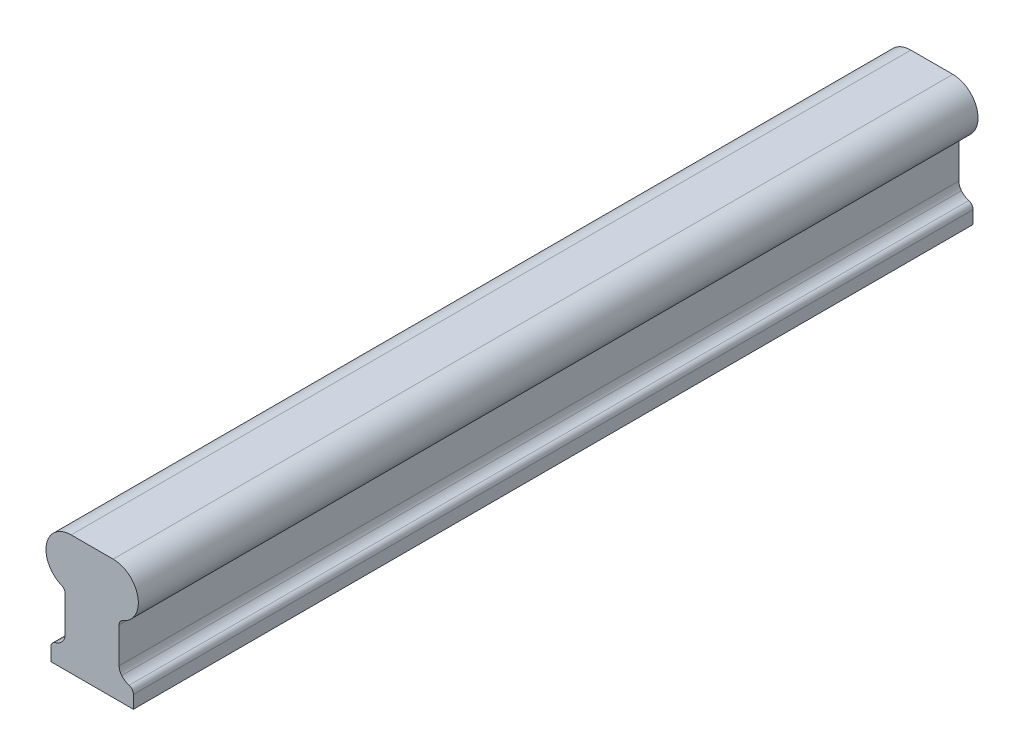
ISO-10303-21;
HEADER;
FILE_DESCRIPTION(('STEP AP214'),'2;1');
FILE_NAME('part.step','',(''),(''),'','','');
FILE_SCHEMA(('AUTOMOTIVE_DESIGN { 1 0 10303 214 1 1 1 1 }'));
ENDSEC;
DATA;
#1=APPLICATION_CONTEXT('core data for automotive mechanical design processes');
#2=APPLICATION_PROTOCOL_DEFINITION('international standard','automotive_design',2000,#1);
#3=PRODUCT_CONTEXT('',#1,'mechanical');
#4=PRODUCT('Part','Part','',(#3));
#5=PRODUCT_RELATED_PRODUCT_CATEGORY('part','',(#4));
#6=PRODUCT_DEFINITION_FORMATION('','',#4);
#7=PRODUCT_DEFINITION_CONTEXT('part definition',#1,'design');
#8=PRODUCT_DEFINITION('design','',#6,#7);
#9=PRODUCT_DEFINITION_SHAPE('','',#8);
#10=(LENGTH_UNIT() NAMED_UNIT(*) SI_UNIT(.MILLI.,.METRE.));
#11=(NAMED_UNIT(*) PLANE_ANGLE_UNIT() SI_UNIT($,.RADIAN.));
#12=(NAMED_UNIT(*) SI_UNIT($,.STERADIAN.) SOLID_ANGLE_UNIT());
#13=UNCERTAINTY_MEASURE_WITH_UNIT(LENGTH_MEASURE(1.E-05),#10,'distance_accuracy_value','');
#14=(GEOMETRIC_REPRESENTATION_CONTEXT(3) GLOBAL_UNCERTAINTY_ASSIGNED_CONTEXT((#13)) GLOBAL_UNIT_ASSIGNED_CONTEXT((#10,
#11,#12)) REPRESENTATION_CONTEXT('',''));
#15=CARTESIAN_POINT('',(0.,0.,0.));
#16=DIRECTION('',(0.,0.,1.));
#17=DIRECTION('',(1.,0.,0.));
#18=AXIS2_PLACEMENT_3D('',#15,#16,#17);
#19=CARTESIAN_POINT('',(0.,0.,355.6));
#20=DIRECTION('',(1.,0.,0.));
#21=DIRECTION('',(0.,0.,-1.));
#22=AXIS2_PLACEMENT_3D('',#19,#20,#21);
#23=PLANE('',#22);
#24=DIRECTION('',(0.,-1.,0.));
#25=VECTOR('',#24,1.);
#26=CARTESIAN_POINT('',(0.,0.,0.));
#27=LINE('',#26,#25);
#28=CARTESIAN_POINT('',(0.,5.4700903291992,0.));
#29=VERTEX_POINT('',#28);
#30=CARTESIAN_POINT('',(0.,0.,0.));
#31=VERTEX_POINT('',#30);
#32=EDGE_CURVE('E181',#29,#31,#27,.T.);
#33=ORIENTED_EDGE('',*,*,#32,.T.);
#34=DIRECTION('',(0.,0.,-1.));
#35=VECTOR('',#34,1.);
#36=CARTESIAN_POINT('',(0.,0.,355.6));
#37=LINE('',#36,#35);
#38=CARTESIAN_POINT('',(0.,0.,355.6));
#39=VERTEX_POINT('',#38);
#40=EDGE_CURVE('E11',#39,#31,#37,.T.);
#41=ORIENTED_EDGE('',*,*,#40,.F.);
#42=DIRECTION('',(0.,-1.,0.));
#43=VECTOR('',#42,1.);
#44=CARTESIAN_POINT('',(0.,0.,355.6));
#45=LINE('',#44,#43);
#46=CARTESIAN_POINT('',(0.,5.4700903291992,355.6));
#47=VERTEX_POINT('',#46);
#48=EDGE_CURVE('E211',#47,#39,#45,.T.);
#49=ORIENTED_EDGE('',*,*,#48,.F.);
#50=DIRECTION('',(0.,0.,-1.));
#51=VECTOR('',#50,1.);
#52=CARTESIAN_POINT('',(0.,5.4700903291992,355.6));
#53=LINE('',#52,#51);
#54=EDGE_CURVE('E177',#47,#29,#53,.T.);
#55=ORIENTED_EDGE('',*,*,#54,.T.);
#56=EDGE_LOOP('',(#33,#41,#49,#55));
#57=FACE_BOUND('',#56,.T.);
#58=ADVANCED_FACE('F37',(#57),#23,.F.);
#59=CARTESIAN_POINT('',(0.,0.,355.6));
#60=DIRECTION('',(0.,1.,0.));
#61=DIRECTION('',(0.,0.,1.));
#62=AXIS2_PLACEMENT_3D('',#59,#60,#61);
#63=PLANE('',#62);
#64=DIRECTION('',(1.,0.,0.));
#65=VECTOR('',#64,1.);
#66=CARTESIAN_POINT('',(0.,0.,0.));
#67=LINE('',#66,#65);
#68=CARTESIAN_POINT('',(34.925,0.,0.));
#69=VERTEX_POINT('',#68);
#70=EDGE_CURVE('E184',#31,#69,#67,.T.);
#71=ORIENTED_EDGE('',*,*,#70,.T.);
#72=DIRECTION('',(0.,0.,-1.));
#73=VECTOR('',#72,1.);
#74=CARTESIAN_POINT('',(34.925,0.,355.6));
#75=LINE('',#74,#73);
#76=CARTESIAN_POINT('',(34.925,0.,355.6));
#77=VERTEX_POINT('',#76);
#78=EDGE_CURVE('E45',#77,#69,#75,.T.);
#79=ORIENTED_EDGE('',*,*,#78,.F.);
#80=DIRECTION('',(1.,0.,0.));
#81=VECTOR('',#80,1.);
#82=CARTESIAN_POINT('',(0.,0.,355.6));
#83=LINE('',#82,#81);
#84=EDGE_CURVE('E120',#39,#77,#83,.T.);
#85=ORIENTED_EDGE('',*,*,#84,.F.);
#86=ORIENTED_EDGE('',*,*,#40,.T.);
#87=EDGE_LOOP('',(#71,#79,#85,#86));
#88=FACE_BOUND('',#87,.T.);
#89=ADVANCED_FACE('F309',(#88),#63,.F.);
#90=CARTESIAN_POINT('',(34.925,0.,355.6));
#91=DIRECTION('',(-1.,0.,0.));
#92=DIRECTION('',(0.,0.,1.));
#93=AXIS2_PLACEMENT_3D('',#90,#91,#92);
#94=PLANE('',#93);
#95=DIRECTION('',(0.,1.,0.));
#96=VECTOR('',#95,1.);
#97=CARTESIAN_POINT('',(34.925,0.,0.));
#98=LINE('',#97,#96);
#99=CARTESIAN_POINT('',(34.925,5.4700903291992,0.));
#100=VERTEX_POINT('',#99);
#101=EDGE_CURVE('E186',#69,#100,#98,.T.);
#102=ORIENTED_EDGE('',*,*,#101,.T.);
#103=DIRECTION('',(0.,0.,-1.));
#104=VECTOR('',#103,1.);
#105=CARTESIAN_POINT('',(34.925,5.4700903291992,355.6));
#106=LINE('',#105,#104);
#107=CARTESIAN_POINT('',(34.925,5.4700903291992,355.6));
#108=VERTEX_POINT('',#107);
#109=EDGE_CURVE('E242',#108,#100,#106,.T.);
#110=ORIENTED_EDGE('',*,*,#109,.F.);
#111=DIRECTION('',(0.,1.,0.));
#112=VECTOR('',#111,1.);
#113=CARTESIAN_POINT('',(34.925,0.,355.6));
#114=LINE('',#113,#112);
#115=EDGE_CURVE('E250',#77,#108,#114,.T.);
#116=ORIENTED_EDGE('',*,*,#115,.F.);
#117=ORIENTED_EDGE('',*,*,#78,.T.);
#118=EDGE_LOOP('',(#102,#110,#116,#117));
#119=FACE_BOUND('',#118,.T.);
#120=ADVANCED_FACE('F248',(#119),#94,.F.);
#121=CARTESIAN_POINT('',(32.385,5.4700903291992,355.6));
#122=DIRECTION('',(0.,0.,-1.));
#123=DIRECTION('',(-1.,0.,0.));
#124=AXIS2_PLACEMENT_3D('',#121,#122,#123);
#125=CYLINDRICAL_SURFACE('',#124,2.54);
#126=CARTESIAN_POINT('',(32.385,5.4700903291992,0.));
#127=DIRECTION('',(0.,0.,1.));
#128=DIRECTION('',(-1.,0.,0.));
#129=AXIS2_PLACEMENT_3D('',#126,#127,#128);
#130=CIRCLE('',#129,2.54);
#131=CARTESIAN_POINT('',(33.1030882831289,7.90647068079312,0.));
#132=VERTEX_POINT('',#131);
#133=EDGE_CURVE('E188',#100,#132,#130,.T.);
#134=ORIENTED_EDGE('',*,*,#133,.T.);
#135=DIRECTION('',(0.,0.,-1.));
#136=VECTOR('',#135,1.);
#137=CARTESIAN_POINT('',(33.1030882831289,7.90647068079312,355.6));
#138=LINE('',#137,#136);
#139=CARTESIAN_POINT('',(33.1030882831289,7.90647068079312,355.6));
#140=VERTEX_POINT('',#139);
#141=EDGE_CURVE('E239',#140,#132,#138,.T.);
#142=ORIENTED_EDGE('',*,*,#141,.F.);
#143=CARTESIAN_POINT('',(32.385,5.4700903291992,355.6));
#144=DIRECTION('',(0.,0.,1.));
#145=DIRECTION('',(-1.,0.,0.));
#146=AXIS2_PLACEMENT_3D('',#143,#144,#145);
#147=CIRCLE('',#146,2.54);
#148=EDGE_CURVE('E268',#108,#140,#147,.T.);
#149=ORIENTED_EDGE('',*,*,#148,.F.);
#150=ORIENTED_EDGE('',*,*,#109,.T.);
#151=EDGE_LOOP('',(#134,#142,#149,#150));
#152=FACE_BOUND('',#151,.T.);
#153=ADVANCED_FACE('F259',(#152),#125,.T.);
#154=CARTESIAN_POINT('',(34.925,14.0879806895373,355.6));
#155=DIRECTION('',(0.,0.,-1.));
#156=DIRECTION('',(-1.,0.,0.));
#157=AXIS2_PLACEMENT_3D('',#154,#155,#156);
#158=CYLINDRICAL_SURFACE('',#157,6.44441062412048);
#159=CARTESIAN_POINT('',(34.925,14.0879806895373,0.));
#160=DIRECTION('',(0.,0.,-1.));
#161=DIRECTION('',(-1.,0.,0.));
#162=AXIS2_PLACEMENT_3D('',#159,#160,#161);
#163=CIRCLE('',#162,6.44441062412048);
#164=CARTESIAN_POINT('',(29.9877953084063,9.94618903306999,0.));
#165=VERTEX_POINT('',#164);
#166=EDGE_CURVE('E190',#132,#165,#163,.T.);
#167=ORIENTED_EDGE('',*,*,#166,.T.);
#168=DIRECTION('',(0.,0.,-1.));
#169=VECTOR('',#168,1.);
#170=CARTESIAN_POINT('',(29.9877953084063,9.94618903306999,355.6));
#171=LINE('',#170,#169);
#172=CARTESIAN_POINT('',(29.9877953084063,9.94618903306999,355.6));
#173=VERTEX_POINT('',#172);
#174=EDGE_CURVE('E236',#173,#165,#171,.T.);
#175=ORIENTED_EDGE('',*,*,#174,.F.);
#176=CARTESIAN_POINT('',(34.925,14.0879806895373,355.6));
#177=DIRECTION('',(0.,0.,-1.));
#178=DIRECTION('',(-1.,0.,0.));
#179=AXIS2_PLACEMENT_3D('',#176,#177,#178);
#180=CIRCLE('',#179,6.44441062412048);
#181=EDGE_CURVE('E265',#140,#173,#180,.T.);
#182=ORIENTED_EDGE('',*,*,#181,.F.);
#183=ORIENTED_EDGE('',*,*,#141,.T.);
#184=EDGE_LOOP('',(#167,#175,#182,#183));
#185=FACE_BOUND('',#184,.T.);
#186=ADVANCED_FACE('F263',(#185),#158,.F.);
#187=CARTESIAN_POINT('',(33.5756906441674,12.9560530946583,355.6));
#188=DIRECTION('',(0.,0.,-1.));
#189=DIRECTION('',(-1.,0.,0.));
#190=AXIS2_PLACEMENT_3D('',#187,#188,#189);
#191=CYLINDRICAL_SURFACE('',#190,4.68319064416736);
#192=CARTESIAN_POINT('',(33.5756906441674,12.9560530946583,0.));
#193=DIRECTION('',(0.,0.,-1.));
#194=DIRECTION('',(1.,0.,0.));
#195=AXIS2_PLACEMENT_3D('',#192,#193,#194);
#196=CIRCLE('',#195,4.68319064416736);
#197=CARTESIAN_POINT('',(28.8925,12.9560530946583,0.));
#198=VERTEX_POINT('',#197);
#199=EDGE_CURVE('E192',#165,#198,#196,.T.);
#200=ORIENTED_EDGE('',*,*,#199,.T.);
#201=DIRECTION('',(0.,0.,-1.));
#202=VECTOR('',#201,1.);
#203=CARTESIAN_POINT('',(28.8925,12.9560530946583,355.6));
#204=LINE('',#203,#202);
#205=CARTESIAN_POINT('',(28.8925,12.9560530946583,355.6));
#206=VERTEX_POINT('',#205);
#207=EDGE_CURVE('E233',#206,#198,#204,.T.);
#208=ORIENTED_EDGE('',*,*,#207,.F.);
#209=CARTESIAN_POINT('',(33.5756906441674,12.9560530946583,355.6));
#210=DIRECTION('',(0.,0.,-1.));
#211=DIRECTION('',(1.,0.,0.));
#212=AXIS2_PLACEMENT_3D('',#209,#210,#211);
#213=CIRCLE('',#212,4.68319064416736);
#214=EDGE_CURVE('E267',#173,#206,#213,.T.);
#215=ORIENTED_EDGE('',*,*,#214,.F.);
#216=ORIENTED_EDGE('',*,*,#174,.T.);
#217=EDGE_LOOP('',(#200,#208,#215,#216));
#218=FACE_BOUND('',#217,.T.);
#219=ADVANCED_FACE('F322',(#218),#191,.F.);
#220=CARTESIAN_POINT('',(28.8925,27.94,355.6));
#221=DIRECTION('',(-1.,0.,0.));
#222=DIRECTION('',(0.,-1.,0.));
#223=AXIS2_PLACEMENT_3D('',#220,#221,#222);
#224=PLANE('',#223);
#225=DIRECTION('',(0.,1.,0.));
#226=VECTOR('',#225,1.);
#227=CARTESIAN_POINT('',(28.8925,27.94,0.));
#228=LINE('',#227,#226);
#229=CARTESIAN_POINT('',(28.8925,27.94,0.));
#230=VERTEX_POINT('',#229);
#231=EDGE_CURVE('E194',#198,#230,#228,.T.);
#232=ORIENTED_EDGE('',*,*,#231,.T.);
#233=DIRECTION('',(0.,0.,-1.));
#234=VECTOR('',#233,1.);
#235=CARTESIAN_POINT('',(28.8925,27.94,355.6));
#236=LINE('',#235,#234);
#237=CARTESIAN_POINT('',(28.8925,27.94,355.6));
#238=VERTEX_POINT('',#237);
#239=EDGE_CURVE('E230',#238,#230,#236,.T.);
#240=ORIENTED_EDGE('',*,*,#239,.F.);
#241=DIRECTION('',(0.,1.,0.));
#242=VECTOR('',#241,1.);
#243=CARTESIAN_POINT('',(28.8925,27.94,355.6));
#244=LINE('',#243,#242);
#245=EDGE_CURVE('E270',#206,#238,#244,.T.);
#246=ORIENTED_EDGE('',*,*,#245,.F.);
#247=ORIENTED_EDGE('',*,*,#207,.T.);
#248=EDGE_LOOP('',(#232,#240,#246,#247));
#249=FACE_BOUND('',#248,.T.);
#250=ADVANCED_FACE('F325',(#249),#224,.F.);
#251=CARTESIAN_POINT('',(31.4325,27.94,355.6));
#252=DIRECTION('',(0.,0.,-1.));
#253=DIRECTION('',(-1.,0.,0.));
#254=AXIS2_PLACEMENT_3D('',#251,#252,#253);
#255=CYLINDRICAL_SURFACE('',#254,2.54);
#256=CARTESIAN_POINT('',(31.4325,27.94,0.));
#257=DIRECTION('',(0.,0.,-1.));
#258=DIRECTION('',(-1.,0.,0.));
#259=AXIS2_PLACEMENT_3D('',#256,#257,#258);
#260=CIRCLE('',#259,2.54);
#261=CARTESIAN_POINT('',(30.4555769230769,30.2846153846154,0.));
#262=VERTEX_POINT('',#261);
#263=EDGE_CURVE('E196',#230,#262,#260,.T.);
#264=ORIENTED_EDGE('',*,*,#263,.T.);
#265=DIRECTION('',(0.,0.,-1.));
#266=VECTOR('',#265,1.);
#267=CARTESIAN_POINT('',(30.4555769230769,30.2846153846154,355.6));
#268=LINE('',#267,#266);
#269=CARTESIAN_POINT('',(30.4555769230769,30.2846153846154,355.6));
#270=VERTEX_POINT('',#269);
#271=EDGE_CURVE('E227',#270,#262,#268,.T.);
#272=ORIENTED_EDGE('',*,*,#271,.F.);
#273=CARTESIAN_POINT('',(31.4325,27.94,355.6));
#274=DIRECTION('',(0.,0.,-1.));
#275=DIRECTION('',(-1.,0.,0.));
#276=AXIS2_PLACEMENT_3D('',#273,#274,#275);
#277=CIRCLE('',#276,2.54);
#278=EDGE_CURVE('E276',#238,#270,#277,.T.);
#279=ORIENTED_EDGE('',*,*,#278,.F.);
#280=ORIENTED_EDGE('',*,*,#239,.T.);
#281=EDGE_LOOP('',(#264,#272,#279,#280));
#282=FACE_BOUND('',#281,.T.);
#283=ADVANCED_FACE('F329',(#282),#255,.F.);
#284=CARTESIAN_POINT('',(26.3525,40.132,355.6));
#285=DIRECTION('',(0.,0.,-1.));
#286=DIRECTION('',(-1.,0.,0.));
#287=AXIS2_PLACEMENT_3D('',#284,#285,#286);
#288=CYLINDRICAL_SURFACE('',#287,10.668);
#289=CARTESIAN_POINT('',(26.3525,40.132,0.));
#290=DIRECTION('',(0.,0.,1.));
#291=DIRECTION('',(-1.,0.,0.));
#292=AXIS2_PLACEMENT_3D('',#289,#290,#291);
#293=CIRCLE('',#292,10.668);
#294=CARTESIAN_POINT('',(26.3525,50.8,0.));
#295=VERTEX_POINT('',#294);
#296=EDGE_CURVE('E198',#262,#295,#293,.T.);
#297=ORIENTED_EDGE('',*,*,#296,.T.);
#298=DIRECTION('',(0.,0.,-1.));
#299=VECTOR('',#298,1.);
#300=CARTESIAN_POINT('',(26.3525,50.8,355.6));
#301=LINE('',#300,#299);
#302=CARTESIAN_POINT('',(26.3525,50.8,355.6));
#303=VERTEX_POINT('',#302);
#304=EDGE_CURVE('E224',#303,#295,#301,.T.);
#305=ORIENTED_EDGE('',*,*,#304,.F.);
#306=CARTESIAN_POINT('',(26.3525,40.132,355.6));
#307=DIRECTION('',(0.,0.,1.));
#308=DIRECTION('',(-1.,0.,0.));
#309=AXIS2_PLACEMENT_3D('',#306,#307,#308);
#310=CIRCLE('',#309,10.668);
#311=EDGE_CURVE('E278',#270,#303,#310,.T.);
#312=ORIENTED_EDGE('',*,*,#311,.F.);
#313=ORIENTED_EDGE('',*,*,#271,.T.);
#314=EDGE_LOOP('',(#297,#305,#312,#313));
#315=FACE_BOUND('',#314,.T.);
#316=ADVANCED_FACE('F333',(#315),#288,.T.);
#317=CARTESIAN_POINT('',(8.5725,50.8,355.6));
#318=DIRECTION('',(0.,-1.,0.));
#319=DIRECTION('',(0.,0.,-1.));
#320=AXIS2_PLACEMENT_3D('',#317,#318,#319);
#321=PLANE('',#320);
#322=DIRECTION('',(-1.,0.,0.));
#323=VECTOR('',#322,1.);
#324=CARTESIAN_POINT('',(8.5725,50.8,0.));
#325=LINE('',#324,#323);
#326=CARTESIAN_POINT('',(8.5725,50.8,0.));
#327=VERTEX_POINT('',#326);
#328=EDGE_CURVE('E200',#295,#327,#325,.T.);
#329=ORIENTED_EDGE('',*,*,#328,.T.);
#330=DIRECTION('',(0.,0.,-1.));
#331=VECTOR('',#330,1.);
#332=CARTESIAN_POINT('',(8.5725,50.8,355.6));
#333=LINE('',#332,#331);
#334=CARTESIAN_POINT('',(8.5725,50.8,355.6));
#335=VERTEX_POINT('',#334);
#336=EDGE_CURVE('E221',#335,#327,#333,.T.);
#337=ORIENTED_EDGE('',*,*,#336,.F.);
#338=DIRECTION('',(-1.,0.,0.));
#339=VECTOR('',#338,1.);
#340=CARTESIAN_POINT('',(8.5725,50.8,355.6));
#341=LINE('',#340,#339);
#342=EDGE_CURVE('E280',#303,#335,#341,.T.);
#343=ORIENTED_EDGE('',*,*,#342,.F.);
#344=ORIENTED_EDGE('',*,*,#304,.T.);
#345=EDGE_LOOP('',(#329,#337,#343,#344));
#346=FACE_BOUND('',#345,.T.);
#347=ADVANCED_FACE('F337',(#346),#321,.F.);
#348=CARTESIAN_POINT('',(8.5725,40.132,355.6));
#349=DIRECTION('',(0.,0.,-1.));
#350=DIRECTION('',(-1.,0.,0.));
#351=AXIS2_PLACEMENT_3D('',#348,#349,#350);
#352=CYLINDRICAL_SURFACE('',#351,10.668);
#353=CARTESIAN_POINT('',(8.5725,40.132,0.));
#354=DIRECTION('',(0.,0.,1.));
#355=DIRECTION('',(1.,0.,0.));
#356=AXIS2_PLACEMENT_3D('',#353,#354,#355);
#357=CIRCLE('',#356,10.668);
#358=CARTESIAN_POINT('',(4.46942307692308,30.2846153846154,0.));
#359=VERTEX_POINT('',#358);
#360=EDGE_CURVE('E202',#327,#359,#357,.T.);
#361=ORIENTED_EDGE('',*,*,#360,.T.);
#362=DIRECTION('',(0.,0.,-1.));
#363=VECTOR('',#362,1.);
#364=CARTESIAN_POINT('',(4.46942307692308,30.2846153846154,355.6));
#365=LINE('',#364,#363);
#366=CARTESIAN_POINT('',(4.46942307692308,30.2846153846154,355.6));
#367=VERTEX_POINT('',#366);
#368=EDGE_CURVE('E218',#367,#359,#365,.T.);
#369=ORIENTED_EDGE('',*,*,#368,.F.);
#370=CARTESIAN_POINT('',(8.5725,40.132,355.6));
#371=DIRECTION('',(0.,0.,1.));
#372=DIRECTION('',(1.,0.,0.));
#373=AXIS2_PLACEMENT_3D('',#370,#371,#372);
#374=CIRCLE('',#373,10.668);
#375=EDGE_CURVE('E282',#335,#367,#374,.T.);
#376=ORIENTED_EDGE('',*,*,#375,.F.);
#377=ORIENTED_EDGE('',*,*,#336,.T.);
#378=EDGE_LOOP('',(#361,#369,#376,#377));
#379=FACE_BOUND('',#378,.T.);
#380=ADVANCED_FACE('F341',(#379),#352,.T.);
#381=CARTESIAN_POINT('',(3.4925,27.94,355.6));
#382=DIRECTION('',(0.,0.,-1.));
#383=DIRECTION('',(-1.,0.,0.));
#384=AXIS2_PLACEMENT_3D('',#381,#382,#383);
#385=CYLINDRICAL_SURFACE('',#384,2.54);
#386=CARTESIAN_POINT('',(3.4925,27.94,0.));
#387=DIRECTION('',(0.,0.,-1.));
#388=DIRECTION('',(-1.,0.,0.));
#389=AXIS2_PLACEMENT_3D('',#386,#387,#388);
#390=CIRCLE('',#389,2.54);
#391=CARTESIAN_POINT('',(6.0325,27.94,0.));
#392=VERTEX_POINT('',#391);
#393=EDGE_CURVE('E204',#359,#392,#390,.T.);
#394=ORIENTED_EDGE('',*,*,#393,.T.);
#395=DIRECTION('',(0.,0.,-1.));
#396=VECTOR('',#395,1.);
#397=CARTESIAN_POINT('',(6.0325,27.94,355.6));
#398=LINE('',#397,#396);
#399=CARTESIAN_POINT('',(6.0325,27.94,355.6));
#400=VERTEX_POINT('',#399);
#401=EDGE_CURVE('E215',#400,#392,#398,.T.);
#402=ORIENTED_EDGE('',*,*,#401,.F.);
#403=CARTESIAN_POINT('',(3.4925,27.94,355.6));
#404=DIRECTION('',(0.,0.,-1.));
#405=DIRECTION('',(-1.,0.,0.));
#406=AXIS2_PLACEMENT_3D('',#403,#404,#405);
#407=CIRCLE('',#406,2.54);
#408=EDGE_CURVE('E284',#367,#400,#407,.T.);
#409=ORIENTED_EDGE('',*,*,#408,.F.);
#410=ORIENTED_EDGE('',*,*,#368,.T.);
#411=EDGE_LOOP('',(#394,#402,#409,#410));
#412=FACE_BOUND('',#411,.T.);
#413=ADVANCED_FACE('F290',(#412),#385,.F.);
#414=CARTESIAN_POINT('',(6.0325,27.94,355.6));
#415=DIRECTION('',(1.,0.,0.));
#416=DIRECTION('',(0.,1.,0.));
#417=AXIS2_PLACEMENT_3D('',#414,#415,#416);
#418=PLANE('',#417);
#419=DIRECTION('',(0.,-1.,0.));
#420=VECTOR('',#419,1.);
#421=CARTESIAN_POINT('',(6.0325,27.94,0.));
#422=LINE('',#421,#420);
#423=CARTESIAN_POINT('',(6.0325,12.9560530946583,0.));
#424=VERTEX_POINT('',#423);
#425=EDGE_CURVE('E206',#392,#424,#422,.T.);
#426=ORIENTED_EDGE('',*,*,#425,.T.);
#427=DIRECTION('',(0.,0.,-1.));
#428=VECTOR('',#427,1.);
#429=CARTESIAN_POINT('',(6.0325,12.9560530946583,355.6));
#430=LINE('',#429,#428);
#431=CARTESIAN_POINT('',(6.0325,12.9560530946583,355.6));
#432=VERTEX_POINT('',#431);
#433=EDGE_CURVE('E172',#432,#424,#430,.T.);
#434=ORIENTED_EDGE('',*,*,#433,.F.);
#435=DIRECTION('',(0.,-1.,0.));
#436=VECTOR('',#435,1.);
#437=CARTESIAN_POINT('',(6.0325,27.94,355.6));
#438=LINE('',#437,#436);
#439=EDGE_CURVE('E163',#400,#432,#438,.T.);
#440=ORIENTED_EDGE('',*,*,#439,.F.);
#441=ORIENTED_EDGE('',*,*,#401,.T.);
#442=EDGE_LOOP('',(#426,#434,#440,#441));
#443=FACE_BOUND('',#442,.T.);
#444=ADVANCED_FACE('F294',(#443),#418,.F.);
#445=CARTESIAN_POINT('',(1.34930935583265,12.9560530946583,355.6));
#446=DIRECTION('',(0.,0.,-1.));
#447=DIRECTION('',(-1.,0.,0.));
#448=AXIS2_PLACEMENT_3D('',#445,#446,#447);
#449=CYLINDRICAL_SURFACE('',#448,4.68319064416735);
#450=CARTESIAN_POINT('',(1.34930935583265,12.9560530946583,0.));
#451=DIRECTION('',(0.,0.,-1.));
#452=DIRECTION('',(-1.,0.,0.));
#453=AXIS2_PLACEMENT_3D('',#450,#451,#452);
#454=CIRCLE('',#453,4.68319064416735);
#455=CARTESIAN_POINT('',(4.93720469159367,9.94618903307001,0.));
#456=VERTEX_POINT('',#455);
#457=EDGE_CURVE('E171',#424,#456,#454,.T.);
#458=ORIENTED_EDGE('',*,*,#457,.T.);
#459=DIRECTION('',(0.,0.,-1.));
#460=VECTOR('',#459,1.);
#461=CARTESIAN_POINT('',(4.93720469159367,9.94618903307001,355.6));
#462=LINE('',#461,#460);
#463=CARTESIAN_POINT('',(4.93720469159367,9.94618903307001,355.6));
#464=VERTEX_POINT('',#463);
#465=EDGE_CURVE('E168',#464,#456,#462,.T.);
#466=ORIENTED_EDGE('',*,*,#465,.F.);
#467=CARTESIAN_POINT('',(1.34930935583265,12.9560530946583,355.6));
#468=DIRECTION('',(0.,0.,-1.));
#469=DIRECTION('',(-1.,0.,0.));
#470=AXIS2_PLACEMENT_3D('',#467,#468,#469);
#471=CIRCLE('',#470,4.68319064416735);
#472=EDGE_CURVE('E157',#432,#464,#471,.T.);
#473=ORIENTED_EDGE('',*,*,#472,.F.);
#474=ORIENTED_EDGE('',*,*,#433,.T.);
#475=EDGE_LOOP('',(#458,#466,#473,#474));
#476=FACE_BOUND('',#475,.T.);
#477=ADVANCED_FACE('F169',(#476),#449,.F.);
#478=CARTESIAN_POINT('',(0.,14.0879806895373,355.6));
#479=DIRECTION('',(0.,0.,-1.));
#480=DIRECTION('',(-1.,0.,0.));
#481=AXIS2_PLACEMENT_3D('',#478,#479,#480);
#482=CYLINDRICAL_SURFACE('',#481,6.44441062412048);
#483=CARTESIAN_POINT('',(0.,14.0879806895373,0.));
#484=DIRECTION('',(0.,0.,-1.));
#485=DIRECTION('',(1.,0.,0.));
#486=AXIS2_PLACEMENT_3D('',#483,#484,#485);
#487=CIRCLE('',#486,6.44441062412048);
#488=CARTESIAN_POINT('',(1.82191171687107,7.90647068079313,0.));
#489=VERTEX_POINT('',#488);
#490=EDGE_CURVE('E106',#456,#489,#487,.T.);
#491=ORIENTED_EDGE('',*,*,#490,.T.);
#492=DIRECTION('',(0.,0.,-1.));
#493=VECTOR('',#492,1.);
#494=CARTESIAN_POINT('',(1.82191171687107,7.90647068079313,355.6));
#495=LINE('',#494,#493);
#496=CARTESIAN_POINT('',(1.82191171687107,7.90647068079313,355.6));
#497=VERTEX_POINT('',#496);
#498=EDGE_CURVE('E173',#497,#489,#495,.T.);
#499=ORIENTED_EDGE('',*,*,#498,.F.);
#500=CARTESIAN_POINT('',(0.,14.0879806895373,355.6));
#501=DIRECTION('',(0.,0.,-1.));
#502=DIRECTION('',(1.,0.,0.));
#503=AXIS2_PLACEMENT_3D('',#500,#501,#502);
#504=CIRCLE('',#503,6.44441062412048);
#505=EDGE_CURVE('E161',#464,#497,#504,.T.);
#506=ORIENTED_EDGE('',*,*,#505,.F.);
#507=ORIENTED_EDGE('',*,*,#465,.T.);
#508=EDGE_LOOP('',(#491,#499,#506,#507));
#509=FACE_BOUND('',#508,.T.);
#510=ADVANCED_FACE('F175',(#509),#482,.F.);
#511=CARTESIAN_POINT('',(2.54,5.4700903291992,355.6));
#512=DIRECTION('',(0.,0.,-1.));
#513=DIRECTION('',(-1.,0.,0.));
#514=AXIS2_PLACEMENT_3D('',#511,#512,#513);
#515=CYLINDRICAL_SURFACE('',#514,2.54);
#516=CARTESIAN_POINT('',(2.54,5.4700903291992,0.));
#517=DIRECTION('',(0.,0.,1.));
#518=DIRECTION('',(-1.,0.,0.));
#519=AXIS2_PLACEMENT_3D('',#516,#517,#518);
#520=CIRCLE('',#519,2.54);
#521=EDGE_CURVE('E112',#489,#29,#520,.T.);
#522=ORIENTED_EDGE('',*,*,#521,.T.);
#523=ORIENTED_EDGE('',*,*,#54,.F.);
#524=CARTESIAN_POINT('',(2.54,5.4700903291992,355.6));
#525=DIRECTION('',(0.,0.,1.));
#526=DIRECTION('',(-1.,0.,0.));
#527=AXIS2_PLACEMENT_3D('',#524,#525,#526);
#528=CIRCLE('',#527,2.54);
#529=EDGE_CURVE('E53',#497,#47,#528,.T.);
#530=ORIENTED_EDGE('',*,*,#529,.F.);
#531=ORIENTED_EDGE('',*,*,#498,.T.);
#532=EDGE_LOOP('',(#522,#523,#530,#531));
#533=FACE_BOUND('',#532,.T.);
#534=ADVANCED_FACE('F298',(#533),#515,.T.);
#535=CARTESIAN_POINT('',(2.54,5.4700903291992,355.6));
#536=DIRECTION('',(0.,0.,-1.));
#537=DIRECTION('',(-1.,0.,0.));
#538=AXIS2_PLACEMENT_3D('',#535,#536,#537);
#539=PLANE('',#538);
#540=ORIENTED_EDGE('',*,*,#48,.T.);
#541=ORIENTED_EDGE('',*,*,#84,.T.);
#542=ORIENTED_EDGE('',*,*,#115,.T.);
#543=ORIENTED_EDGE('',*,*,#148,.T.);
#544=ORIENTED_EDGE('',*,*,#181,.T.);
#545=ORIENTED_EDGE('',*,*,#214,.T.);
#546=ORIENTED_EDGE('',*,*,#245,.T.);
#547=ORIENTED_EDGE('',*,*,#278,.T.);
#548=ORIENTED_EDGE('',*,*,#311,.T.);
#549=ORIENTED_EDGE('',*,*,#342,.T.);
#550=ORIENTED_EDGE('',*,*,#375,.T.);
#551=ORIENTED_EDGE('',*,*,#408,.T.);
#552=ORIENTED_EDGE('',*,*,#439,.T.);
#553=ORIENTED_EDGE('',*,*,#472,.T.);
#554=ORIENTED_EDGE('',*,*,#505,.T.);
#555=ORIENTED_EDGE('',*,*,#529,.T.);
#556=EDGE_LOOP('',(#540,#541,#542,#543,#544,#545,#546,#547,#548,#549,#550,#551,#552,#553,#554,#555));
#557=FACE_BOUND('',#556,.T.);
#558=ADVANCED_FACE('F159',(#557),#539,.F.);
#559=CARTESIAN_POINT('',(2.54,5.4700903291992,0.));
#560=DIRECTION('',(0.,0.,-1.));
#561=DIRECTION('',(-1.,0.,0.));
#562=AXIS2_PLACEMENT_3D('',#559,#560,#561);
#563=PLANE('',#562);
#564=ORIENTED_EDGE('',*,*,#32,.F.);
#565=ORIENTED_EDGE('',*,*,#521,.F.);
#566=ORIENTED_EDGE('',*,*,#490,.F.);
#567=ORIENTED_EDGE('',*,*,#457,.F.);
#568=ORIENTED_EDGE('',*,*,#425,.F.);
#569=ORIENTED_EDGE('',*,*,#393,.F.);
#570=ORIENTED_EDGE('',*,*,#360,.F.);
#571=ORIENTED_EDGE('',*,*,#328,.F.);
#572=ORIENTED_EDGE('',*,*,#296,.F.);
#573=ORIENTED_EDGE('',*,*,#263,.F.);
#574=ORIENTED_EDGE('',*,*,#231,.F.);
#575=ORIENTED_EDGE('',*,*,#199,.F.);
#576=ORIENTED_EDGE('',*,*,#166,.F.);
#577=ORIENTED_EDGE('',*,*,#133,.F.);
#578=ORIENTED_EDGE('',*,*,#101,.F.);
#579=ORIENTED_EDGE('',*,*,#70,.F.);
#580=EDGE_LOOP('',(#564,#565,#566,#567,#568,#569,#570,#571,#572,#573,#574,#575,#576,#577,#578,#579));
#581=FACE_BOUND('',#580,.T.);
#582=ADVANCED_FACE('F254',(#581),#563,.T.);
#583=CLOSED_SHELL('',(#58,#89,#120,#153,#186,#219,#250,#283,#316,#347,#380,#413,#444,#477,#510,
#534,#558,#582));
#584=MANIFOLD_SOLID_BREP('B2',#583);
#585=ADVANCED_BREP_SHAPE_REPRESENTATION('',(#18,#584),#14);
#586=SHAPE_DEFINITION_REPRESENTATION(#9,#585);
ENDSEC;
END-ISO-10303-21;
